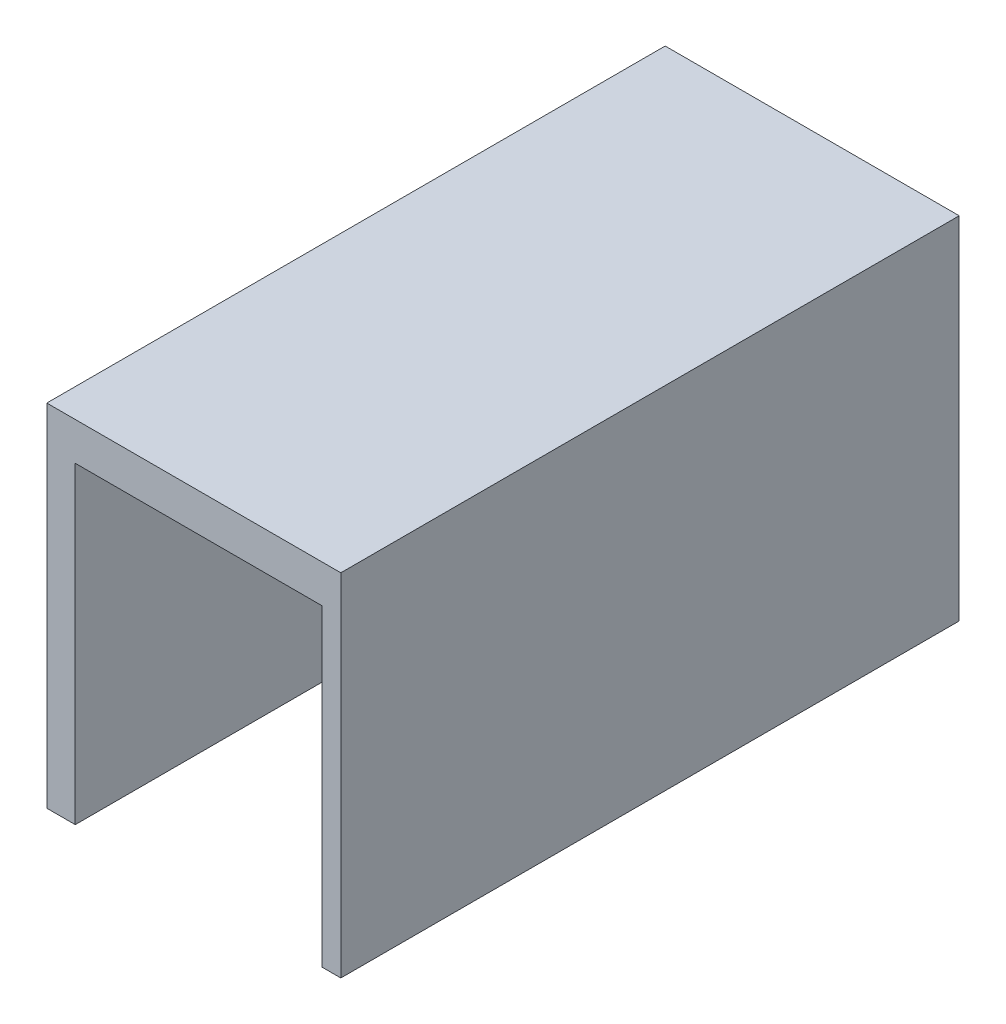
ISO-10303-21;
HEADER;
FILE_DESCRIPTION(('STEP AP214'),'2;1');
FILE_NAME('part.step','',(''),(''),'','','');
FILE_SCHEMA(('AUTOMOTIVE_DESIGN { 1 0 10303 214 1 1 1 1 }'));
ENDSEC;
DATA;
#1=APPLICATION_CONTEXT('core data for automotive mechanical design processes');
#2=APPLICATION_PROTOCOL_DEFINITION('international standard','automotive_design',2000,#1);
#3=PRODUCT_CONTEXT('',#1,'mechanical');
#4=PRODUCT('Part','Part','',(#3));
#5=PRODUCT_RELATED_PRODUCT_CATEGORY('part','',(#4));
#6=PRODUCT_DEFINITION_FORMATION('','',#4);
#7=PRODUCT_DEFINITION_CONTEXT('part definition',#1,'design');
#8=PRODUCT_DEFINITION('design','',#6,#7);
#9=PRODUCT_DEFINITION_SHAPE('','',#8);
#10=(LENGTH_UNIT() NAMED_UNIT(*) SI_UNIT(.MILLI.,.METRE.));
#11=(NAMED_UNIT(*) PLANE_ANGLE_UNIT() SI_UNIT($,.RADIAN.));
#12=(NAMED_UNIT(*) SI_UNIT($,.STERADIAN.) SOLID_ANGLE_UNIT());
#13=UNCERTAINTY_MEASURE_WITH_UNIT(LENGTH_MEASURE(1.E-05),#10,'distance_accuracy_value','');
#14=(GEOMETRIC_REPRESENTATION_CONTEXT(3) GLOBAL_UNCERTAINTY_ASSIGNED_CONTEXT((#13)) GLOBAL_UNIT_ASSIGNED_CONTEXT((#10,
#11,#12)) REPRESENTATION_CONTEXT('',''));
#15=CARTESIAN_POINT('',(0.,0.,0.));
#16=DIRECTION('',(0.,0.,1.));
#17=DIRECTION('',(1.,0.,0.));
#18=AXIS2_PLACEMENT_3D('',#15,#16,#17);
#19=CARTESIAN_POINT('',(-13.,-16.5,65.2));
#20=DIRECTION('',(-1.,0.,0.));
#21=DIRECTION('',(0.,0.,1.));
#22=AXIS2_PLACEMENT_3D('',#19,#20,#21);
#23=PLANE('',#22);
#24=DIRECTION('',(0.,1.,0.));
#25=VECTOR('',#24,1.);
#26=CARTESIAN_POINT('',(-13.,-16.5,0.));
#27=LINE('',#26,#25);
#28=CARTESIAN_POINT('',(-13.,-16.5,0.));
#29=VERTEX_POINT('',#28);
#30=CARTESIAN_POINT('',(-13.,16.5,0.));
#31=VERTEX_POINT('',#30);
#32=EDGE_CURVE('E146',#29,#31,#27,.T.);
#33=ORIENTED_EDGE('',*,*,#32,.T.);
#34=DIRECTION('',(0.,0.,-1.));
#35=VECTOR('',#34,1.);
#36=CARTESIAN_POINT('',(-13.,16.5,65.2));
#37=LINE('',#36,#35);
#38=CARTESIAN_POINT('',(-13.,16.5,65.2));
#39=VERTEX_POINT('',#38);
#40=EDGE_CURVE('E11',#39,#31,#37,.T.);
#41=ORIENTED_EDGE('',*,*,#40,.F.);
#42=DIRECTION('',(0.,1.,0.));
#43=VECTOR('',#42,1.);
#44=CARTESIAN_POINT('',(-13.,-16.5,65.2));
#45=LINE('',#44,#43);
#46=CARTESIAN_POINT('',(-13.,-16.5,65.2));
#47=VERTEX_POINT('',#46);
#48=EDGE_CURVE('E168',#47,#39,#45,.T.);
#49=ORIENTED_EDGE('',*,*,#48,.F.);
#50=DIRECTION('',(0.,0.,-1.));
#51=VECTOR('',#50,1.);
#52=CARTESIAN_POINT('',(-13.,-16.5,65.2));
#53=LINE('',#52,#51);
#54=EDGE_CURVE('E145',#47,#29,#53,.T.);
#55=ORIENTED_EDGE('',*,*,#54,.T.);
#56=EDGE_LOOP('',(#33,#41,#49,#55));
#57=FACE_BOUND('',#56,.T.);
#58=ADVANCED_FACE('F39',(#57),#23,.F.);
#59=CARTESIAN_POINT('',(13.,16.5,65.2));
#60=DIRECTION('',(0.,1.,0.));
#61=DIRECTION('',(0.,0.,1.));
#62=AXIS2_PLACEMENT_3D('',#59,#60,#61);
#63=PLANE('',#62);
#64=DIRECTION('',(1.,0.,0.));
#65=VECTOR('',#64,1.);
#66=CARTESIAN_POINT('',(13.,16.5,0.));
#67=LINE('',#66,#65);
#68=CARTESIAN_POINT('',(13.,16.5,0.));
#69=VERTEX_POINT('',#68);
#70=EDGE_CURVE('E150',#31,#69,#67,.T.);
#71=ORIENTED_EDGE('',*,*,#70,.T.);
#72=DIRECTION('',(0.,0.,-1.));
#73=VECTOR('',#72,1.);
#74=CARTESIAN_POINT('',(13.,16.5,65.2));
#75=LINE('',#74,#73);
#76=CARTESIAN_POINT('',(13.,16.5,65.2));
#77=VERTEX_POINT('',#76);
#78=EDGE_CURVE('E47',#77,#69,#75,.T.);
#79=ORIENTED_EDGE('',*,*,#78,.F.);
#80=DIRECTION('',(1.,0.,0.));
#81=VECTOR('',#80,1.);
#82=CARTESIAN_POINT('',(13.,16.5,65.2));
#83=LINE('',#82,#81);
#84=EDGE_CURVE('E99',#39,#77,#83,.T.);
#85=ORIENTED_EDGE('',*,*,#84,.F.);
#86=ORIENTED_EDGE('',*,*,#40,.T.);
#87=EDGE_LOOP('',(#71,#79,#85,#86));
#88=FACE_BOUND('',#87,.T.);
#89=ADVANCED_FACE('F216',(#88),#63,.F.);
#90=CARTESIAN_POINT('',(13.,-16.5,65.2));
#91=DIRECTION('',(1.,0.,0.));
#92=DIRECTION('',(0.,0.,-1.));
#93=AXIS2_PLACEMENT_3D('',#90,#91,#92);
#94=PLANE('',#93);
#95=DIRECTION('',(0.,-1.,0.));
#96=VECTOR('',#95,1.);
#97=CARTESIAN_POINT('',(13.,-16.5,0.));
#98=LINE('',#97,#96);
#99=CARTESIAN_POINT('',(13.,-16.5,0.));
#100=VERTEX_POINT('',#99);
#101=EDGE_CURVE('E154',#69,#100,#98,.T.);
#102=ORIENTED_EDGE('',*,*,#101,.T.);
#103=DIRECTION('',(0.,0.,-1.));
#104=VECTOR('',#103,1.);
#105=CARTESIAN_POINT('',(13.,-16.5,65.2));
#106=LINE('',#105,#104);
#107=CARTESIAN_POINT('',(13.,-16.5,65.2));
#108=VERTEX_POINT('',#107);
#109=EDGE_CURVE('E130',#108,#100,#106,.T.);
#110=ORIENTED_EDGE('',*,*,#109,.F.);
#111=DIRECTION('',(0.,-1.,0.));
#112=VECTOR('',#111,1.);
#113=CARTESIAN_POINT('',(13.,-16.5,65.2));
#114=LINE('',#113,#112);
#115=EDGE_CURVE('E116',#77,#108,#114,.T.);
#116=ORIENTED_EDGE('',*,*,#115,.F.);
#117=ORIENTED_EDGE('',*,*,#78,.T.);
#118=EDGE_LOOP('',(#102,#110,#116,#117));
#119=FACE_BOUND('',#118,.T.);
#120=ADVANCED_FACE('F178',(#119),#94,.F.);
#121=CARTESIAN_POINT('',(15.,-16.5,65.2));
#122=DIRECTION('',(0.,1.,0.));
#123=DIRECTION('',(-1.,0.,0.));
#124=AXIS2_PLACEMENT_3D('',#121,#122,#123);
#125=PLANE('',#124);
#126=DIRECTION('',(1.,0.,0.));
#127=VECTOR('',#126,1.);
#128=CARTESIAN_POINT('',(15.,-16.5,0.));
#129=LINE('',#128,#127);
#130=CARTESIAN_POINT('',(15.,-16.5,0.));
#131=VERTEX_POINT('',#130);
#132=EDGE_CURVE('E126',#100,#131,#129,.T.);
#133=ORIENTED_EDGE('',*,*,#132,.T.);
#134=DIRECTION('',(0.,0.,-1.));
#135=VECTOR('',#134,1.);
#136=CARTESIAN_POINT('',(15.,-16.5,65.2));
#137=LINE('',#136,#135);
#138=CARTESIAN_POINT('',(15.,-16.5,65.2));
#139=VERTEX_POINT('',#138);
#140=EDGE_CURVE('E123',#139,#131,#137,.T.);
#141=ORIENTED_EDGE('',*,*,#140,.F.);
#142=DIRECTION('',(1.,0.,0.));
#143=VECTOR('',#142,1.);
#144=CARTESIAN_POINT('',(15.,-16.5,65.2));
#145=LINE('',#144,#143);
#146=EDGE_CURVE('E108',#108,#139,#145,.T.);
#147=ORIENTED_EDGE('',*,*,#146,.F.);
#148=ORIENTED_EDGE('',*,*,#109,.T.);
#149=EDGE_LOOP('',(#133,#141,#147,#148));
#150=FACE_BOUND('',#149,.T.);
#151=ADVANCED_FACE('F124',(#150),#125,.F.);
#152=CARTESIAN_POINT('',(15.,20.5,65.2));
#153=DIRECTION('',(-1.,0.,0.));
#154=DIRECTION('',(0.,-1.,0.));
#155=AXIS2_PLACEMENT_3D('',#152,#153,#154);
#156=PLANE('',#155);
#157=DIRECTION('',(0.,1.,0.));
#158=VECTOR('',#157,1.);
#159=CARTESIAN_POINT('',(15.,20.5,0.));
#160=LINE('',#159,#158);
#161=CARTESIAN_POINT('',(15.,20.5,0.));
#162=VERTEX_POINT('',#161);
#163=EDGE_CURVE('E159',#131,#162,#160,.T.);
#164=ORIENTED_EDGE('',*,*,#163,.T.);
#165=DIRECTION('',(0.,0.,-1.));
#166=VECTOR('',#165,1.);
#167=CARTESIAN_POINT('',(15.,20.5,65.2));
#168=LINE('',#167,#166);
#169=CARTESIAN_POINT('',(15.,20.5,65.2));
#170=VERTEX_POINT('',#169);
#171=EDGE_CURVE('E131',#170,#162,#168,.T.);
#172=ORIENTED_EDGE('',*,*,#171,.F.);
#173=DIRECTION('',(0.,1.,0.));
#174=VECTOR('',#173,1.);
#175=CARTESIAN_POINT('',(15.,20.5,65.2));
#176=LINE('',#175,#174);
#177=EDGE_CURVE('E113',#139,#170,#176,.T.);
#178=ORIENTED_EDGE('',*,*,#177,.F.);
#179=ORIENTED_EDGE('',*,*,#140,.T.);
#180=EDGE_LOOP('',(#164,#172,#178,#179));
#181=FACE_BOUND('',#180,.T.);
#182=ADVANCED_FACE('F133',(#181),#156,.F.);
#183=CARTESIAN_POINT('',(-15.,20.5,65.2));
#184=DIRECTION('',(0.,-1.,0.));
#185=DIRECTION('',(0.,0.,-1.));
#186=AXIS2_PLACEMENT_3D('',#183,#184,#185);
#187=PLANE('',#186);
#188=DIRECTION('',(-1.,0.,0.));
#189=VECTOR('',#188,1.);
#190=CARTESIAN_POINT('',(-15.,20.5,0.));
#191=LINE('',#190,#189);
#192=CARTESIAN_POINT('',(-16.,20.5,0.));
#193=VERTEX_POINT('',#192);
#194=EDGE_CURVE('E162',#162,#193,#191,.T.);
#195=ORIENTED_EDGE('',*,*,#194,.T.);
#196=DIRECTION('',(0.,0.,-1.));
#197=VECTOR('',#196,1.);
#198=CARTESIAN_POINT('',(-16.,20.5,65.2));
#199=LINE('',#198,#197);
#200=CARTESIAN_POINT('',(-16.,20.5,65.2));
#201=VERTEX_POINT('',#200);
#202=EDGE_CURVE('E151',#201,#193,#199,.T.);
#203=ORIENTED_EDGE('',*,*,#202,.F.);
#204=DIRECTION('',(-1.,0.,0.));
#205=VECTOR('',#204,1.);
#206=CARTESIAN_POINT('',(-15.,20.5,65.2));
#207=LINE('',#206,#205);
#208=EDGE_CURVE('E137',#170,#201,#207,.T.);
#209=ORIENTED_EDGE('',*,*,#208,.F.);
#210=ORIENTED_EDGE('',*,*,#171,.T.);
#211=EDGE_LOOP('',(#195,#203,#209,#210));
#212=FACE_BOUND('',#211,.T.);
#213=ADVANCED_FACE('F185',(#212),#187,.F.);
#214=CARTESIAN_POINT('',(-13.,-16.5,65.2));
#215=DIRECTION('',(0.,1.,0.));
#216=DIRECTION('',(-1.,0.,0.));
#217=AXIS2_PLACEMENT_3D('',#214,#215,#216);
#218=PLANE('',#217);
#219=DIRECTION('',(1.,0.,0.));
#220=VECTOR('',#219,1.);
#221=CARTESIAN_POINT('',(-13.,-16.5,0.));
#222=LINE('',#221,#220);
#223=CARTESIAN_POINT('',(-16.,-16.5,0.));
#224=VERTEX_POINT('',#223);
#225=EDGE_CURVE('E91',#224,#29,#222,.T.);
#226=ORIENTED_EDGE('',*,*,#225,.T.);
#227=ORIENTED_EDGE('',*,*,#54,.F.);
#228=DIRECTION('',(1.,0.,0.));
#229=VECTOR('',#228,1.);
#230=CARTESIAN_POINT('',(-13.,-16.5,65.2));
#231=LINE('',#230,#229);
#232=CARTESIAN_POINT('',(-16.,-16.5,65.2));
#233=VERTEX_POINT('',#232);
#234=EDGE_CURVE('E63',#233,#47,#231,.T.);
#235=ORIENTED_EDGE('',*,*,#234,.F.);
#236=DIRECTION('',(0.,0.,1.));
#237=VECTOR('',#236,1.);
#238=CARTESIAN_POINT('',(-16.,-16.5,65.2));
#239=LINE('',#238,#237);
#240=EDGE_CURVE('E199',#224,#233,#239,.T.);
#241=ORIENTED_EDGE('',*,*,#240,.F.);
#242=EDGE_LOOP('',(#226,#227,#235,#241));
#243=FACE_BOUND('',#242,.T.);
#244=ADVANCED_FACE('F230',(#243),#218,.F.);
#245=CARTESIAN_POINT('',(0.,0.,65.2));
#246=DIRECTION('',(0.,0.,1.));
#247=DIRECTION('',(1.,0.,0.));
#248=AXIS2_PLACEMENT_3D('',#245,#246,#247);
#249=PLANE('',#248);
#250=ORIENTED_EDGE('',*,*,#48,.T.);
#251=ORIENTED_EDGE('',*,*,#84,.T.);
#252=ORIENTED_EDGE('',*,*,#115,.T.);
#253=ORIENTED_EDGE('',*,*,#146,.T.);
#254=ORIENTED_EDGE('',*,*,#177,.T.);
#255=ORIENTED_EDGE('',*,*,#208,.T.);
#256=DIRECTION('',(0.,1.,0.));
#257=VECTOR('',#256,1.);
#258=CARTESIAN_POINT('',(-16.,-16.5,65.2));
#259=LINE('',#258,#257);
#260=EDGE_CURVE('E192',#233,#201,#259,.T.);
#261=ORIENTED_EDGE('',*,*,#260,.F.);
#262=ORIENTED_EDGE('',*,*,#234,.T.);
#263=EDGE_LOOP('',(#250,#251,#252,#253,#254,#255,#261,#262));
#264=FACE_BOUND('',#263,.T.);
#265=ADVANCED_FACE('F110',(#264),#249,.T.);
#266=CARTESIAN_POINT('',(0.,0.,0.));
#267=DIRECTION('',(0.,0.,1.));
#268=DIRECTION('',(1.,0.,0.));
#269=AXIS2_PLACEMENT_3D('',#266,#267,#268);
#270=PLANE('',#269);
#271=ORIENTED_EDGE('',*,*,#32,.F.);
#272=ORIENTED_EDGE('',*,*,#225,.F.);
#273=DIRECTION('',(0.,-1.,0.));
#274=VECTOR('',#273,1.);
#275=CARTESIAN_POINT('',(-16.,-16.5,0.));
#276=LINE('',#275,#274);
#277=EDGE_CURVE('E205',#193,#224,#276,.T.);
#278=ORIENTED_EDGE('',*,*,#277,.F.);
#279=ORIENTED_EDGE('',*,*,#194,.F.);
#280=ORIENTED_EDGE('',*,*,#163,.F.);
#281=ORIENTED_EDGE('',*,*,#132,.F.);
#282=ORIENTED_EDGE('',*,*,#101,.F.);
#283=ORIENTED_EDGE('',*,*,#70,.F.);
#284=EDGE_LOOP('',(#271,#272,#278,#279,#280,#281,#282,#283));
#285=FACE_BOUND('',#284,.T.);
#286=ADVANCED_FACE('F181',(#285),#270,.F.);
#287=CARTESIAN_POINT('',(-16.,0.,0.));
#288=DIRECTION('',(-1.,0.,0.));
#289=DIRECTION('',(0.,0.,1.));
#290=AXIS2_PLACEMENT_3D('',#287,#288,#289);
#291=PLANE('',#290);
#292=ORIENTED_EDGE('',*,*,#277,.T.);
#293=ORIENTED_EDGE('',*,*,#240,.T.);
#294=ORIENTED_EDGE('',*,*,#260,.T.);
#295=ORIENTED_EDGE('',*,*,#202,.T.);
#296=EDGE_LOOP('',(#292,#293,#294,#295));
#297=FACE_BOUND('',#296,.T.);
#298=DIRECTION('',(0.,0.,1.));
#299=VECTOR('',#298,1.);
#300=CARTESIAN_POINT('',(-16.,-15.83,64.53));
#301=LINE('',#300,#299);
#302=CARTESIAN_POINT('',(-16.,-15.83,0.670000000000004));
#303=VERTEX_POINT('',#302);
#304=CARTESIAN_POINT('',(-16.,-15.83,64.53));
#305=VERTEX_POINT('',#304);
#306=EDGE_CURVE('E318',#303,#305,#301,.T.);
#307=ORIENTED_EDGE('',*,*,#306,.F.);
#308=DIRECTION('',(0.,-1.,0.));
#309=VECTOR('',#308,1.);
#310=CARTESIAN_POINT('',(-16.,-15.83,0.670000000000004));
#311=LINE('',#310,#309);
#312=CARTESIAN_POINT('',(-16.,19.83,0.670000000000004));
#313=VERTEX_POINT('',#312);
#314=EDGE_CURVE('E272',#313,#303,#311,.T.);
#315=ORIENTED_EDGE('',*,*,#314,.F.);
#316=DIRECTION('',(0.,0.,-1.));
#317=VECTOR('',#316,1.);
#318=CARTESIAN_POINT('',(-16.,19.83,64.53));
#319=LINE('',#318,#317);
#320=CARTESIAN_POINT('',(-16.,19.83,64.53));
#321=VERTEX_POINT('',#320);
#322=EDGE_CURVE('E289',#321,#313,#319,.T.);
#323=ORIENTED_EDGE('',*,*,#322,.F.);
#324=DIRECTION('',(0.,1.,0.));
#325=VECTOR('',#324,1.);
#326=CARTESIAN_POINT('',(-16.,-15.83,64.53));
#327=LINE('',#326,#325);
#328=EDGE_CURVE('E321',#305,#321,#327,.T.);
#329=ORIENTED_EDGE('',*,*,#328,.F.);
#330=EDGE_LOOP('',(#307,#315,#323,#329));
#331=FACE_BOUND('',#330,.T.);
#332=ADVANCED_FACE('F197',(#297,#331),#291,.T.);
#333=CARTESIAN_POINT('',(-16.,-15.83,0.670000000000004));
#334=DIRECTION('',(0.,0.,1.));
#335=DIRECTION('',(1.,0.,0.));
#336=AXIS2_PLACEMENT_3D('',#333,#334,#335);
#337=PLANE('',#336);
#338=DIRECTION('',(0.,-1.,0.));
#339=VECTOR('',#338,1.);
#340=CARTESIAN_POINT('',(-15.,-15.83,0.670000000000004));
#341=LINE('',#340,#339);
#342=CARTESIAN_POINT('',(-15.,19.83,0.670000000000004));
#343=VERTEX_POINT('',#342);
#344=CARTESIAN_POINT('',(-15.,-15.83,0.670000000000004));
#345=VERTEX_POINT('',#344);
#346=EDGE_CURVE('E283',#343,#345,#341,.T.);
#347=ORIENTED_EDGE('',*,*,#346,.F.);
#348=DIRECTION('',(1.,0.,0.));
#349=VECTOR('',#348,1.);
#350=CARTESIAN_POINT('',(-16.,19.83,0.670000000000004));
#351=LINE('',#350,#349);
#352=EDGE_CURVE('E54',#313,#343,#351,.T.);
#353=ORIENTED_EDGE('',*,*,#352,.F.);
#354=ORIENTED_EDGE('',*,*,#314,.T.);
#355=DIRECTION('',(1.,0.,0.));
#356=VECTOR('',#355,1.);
#357=CARTESIAN_POINT('',(-16.,-15.83,0.670000000000004));
#358=LINE('',#357,#356);
#359=EDGE_CURVE('E296',#303,#345,#358,.T.);
#360=ORIENTED_EDGE('',*,*,#359,.T.);
#361=EDGE_LOOP('',(#347,#353,#354,#360));
#362=FACE_BOUND('',#361,.T.);
#363=ADVANCED_FACE('F244',(#362),#337,.T.);
#364=CARTESIAN_POINT('',(-16.,-15.83,64.53));
#365=DIRECTION('',(0.,1.,0.));
#366=DIRECTION('',(0.,0.,1.));
#367=AXIS2_PLACEMENT_3D('',#364,#365,#366);
#368=PLANE('',#367);
#369=DIRECTION('',(0.,0.,1.));
#370=VECTOR('',#369,1.);
#371=CARTESIAN_POINT('',(-15.,-15.83,64.53));
#372=LINE('',#371,#370);
#373=CARTESIAN_POINT('',(-15.,-15.83,64.53));
#374=VERTEX_POINT('',#373);
#375=EDGE_CURVE('E278',#345,#374,#372,.T.);
#376=ORIENTED_EDGE('',*,*,#375,.F.);
#377=ORIENTED_EDGE('',*,*,#359,.F.);
#378=ORIENTED_EDGE('',*,*,#306,.T.);
#379=DIRECTION('',(1.,0.,0.));
#380=VECTOR('',#379,1.);
#381=CARTESIAN_POINT('',(-16.,-15.83,64.53));
#382=LINE('',#381,#380);
#383=EDGE_CURVE('E292',#305,#374,#382,.T.);
#384=ORIENTED_EDGE('',*,*,#383,.T.);
#385=EDGE_LOOP('',(#376,#377,#378,#384));
#386=FACE_BOUND('',#385,.T.);
#387=ADVANCED_FACE('F247',(#386),#368,.T.);
#388=CARTESIAN_POINT('',(-16.,-15.83,64.53));
#389=DIRECTION('',(0.,0.,-1.));
#390=DIRECTION('',(-1.,0.,0.));
#391=AXIS2_PLACEMENT_3D('',#388,#389,#390);
#392=PLANE('',#391);
#393=DIRECTION('',(0.,1.,0.));
#394=VECTOR('',#393,1.);
#395=CARTESIAN_POINT('',(-15.,-15.83,64.53));
#396=LINE('',#395,#394);
#397=CARTESIAN_POINT('',(-15.,19.83,64.53));
#398=VERTEX_POINT('',#397);
#399=EDGE_CURVE('E273',#374,#398,#396,.T.);
#400=ORIENTED_EDGE('',*,*,#399,.F.);
#401=ORIENTED_EDGE('',*,*,#383,.F.);
#402=ORIENTED_EDGE('',*,*,#328,.T.);
#403=DIRECTION('',(1.,0.,0.));
#404=VECTOR('',#403,1.);
#405=CARTESIAN_POINT('',(-16.,19.83,64.53));
#406=LINE('',#405,#404);
#407=EDGE_CURVE('E265',#321,#398,#406,.T.);
#408=ORIENTED_EDGE('',*,*,#407,.T.);
#409=EDGE_LOOP('',(#400,#401,#402,#408));
#410=FACE_BOUND('',#409,.T.);
#411=ADVANCED_FACE('F251',(#410),#392,.T.);
#412=CARTESIAN_POINT('',(-16.,19.83,64.53));
#413=DIRECTION('',(0.,-1.,0.));
#414=DIRECTION('',(0.,0.,-1.));
#415=AXIS2_PLACEMENT_3D('',#412,#413,#414);
#416=PLANE('',#415);
#417=DIRECTION('',(0.,0.,-1.));
#418=VECTOR('',#417,1.);
#419=CARTESIAN_POINT('',(-15.,19.83,64.53));
#420=LINE('',#419,#418);
#421=EDGE_CURVE('E262',#398,#343,#420,.T.);
#422=ORIENTED_EDGE('',*,*,#421,.F.);
#423=ORIENTED_EDGE('',*,*,#407,.F.);
#424=ORIENTED_EDGE('',*,*,#322,.T.);
#425=ORIENTED_EDGE('',*,*,#352,.T.);
#426=EDGE_LOOP('',(#422,#423,#424,#425));
#427=FACE_BOUND('',#426,.T.);
#428=ADVANCED_FACE('F234',(#427),#416,.T.);
#429=CARTESIAN_POINT('',(-15.,-16.5,65.2));
#430=DIRECTION('',(1.,0.,0.));
#431=DIRECTION('',(0.,0.,-1.));
#432=AXIS2_PLACEMENT_3D('',#429,#430,#431);
#433=PLANE('',#432);
#434=ORIENTED_EDGE('',*,*,#421,.T.);
#435=ORIENTED_EDGE('',*,*,#346,.T.);
#436=ORIENTED_EDGE('',*,*,#375,.T.);
#437=ORIENTED_EDGE('',*,*,#399,.T.);
#438=EDGE_LOOP('',(#434,#435,#436,#437));
#439=FACE_BOUND('',#438,.T.);
#440=ADVANCED_FACE('F231',(#439),#433,.F.);
#441=CLOSED_SHELL('',(#58,#89,#120,#151,#182,#213,#244,#265,#286,#332,#363,#387,#411,#428,#440));
#442=MANIFOLD_SOLID_BREP('B2',#441);
#443=ADVANCED_BREP_SHAPE_REPRESENTATION('',(#18,#442),#14);
#444=SHAPE_DEFINITION_REPRESENTATION(#9,#443);
ENDSEC;
END-ISO-10303-21;
